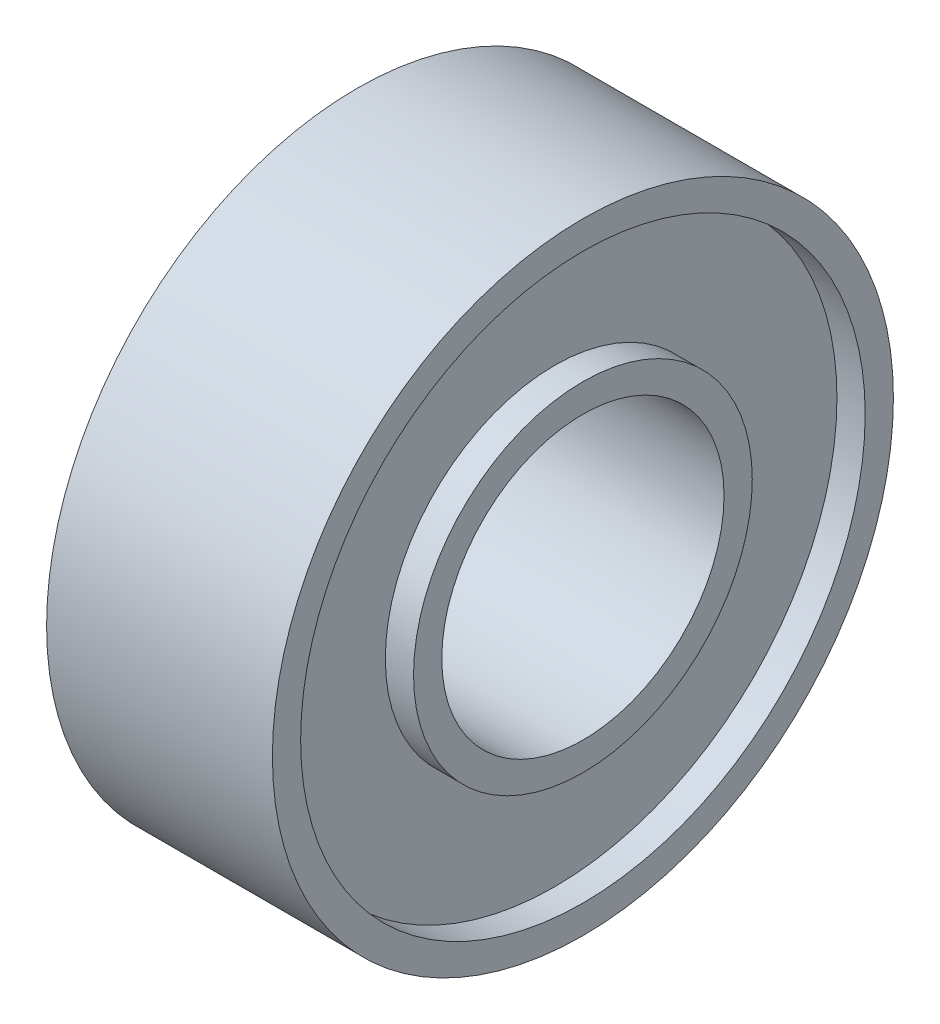
ISO-10303-21;
HEADER;
FILE_DESCRIPTION(('STEP AP214'),'2;1');
FILE_NAME('part.step','',(''),(''),'','','');
FILE_SCHEMA(('AUTOMOTIVE_DESIGN { 1 0 10303 214 1 1 1 1 }'));
ENDSEC;
DATA;
#1=APPLICATION_CONTEXT('core data for automotive mechanical design processes');
#2=APPLICATION_PROTOCOL_DEFINITION('international standard','automotive_design',2000,#1);
#3=PRODUCT_CONTEXT('',#1,'mechanical');
#4=PRODUCT('Part','Part','',(#3));
#5=PRODUCT_RELATED_PRODUCT_CATEGORY('part','',(#4));
#6=PRODUCT_DEFINITION_FORMATION('','',#4);
#7=PRODUCT_DEFINITION_CONTEXT('part definition',#1,'design');
#8=PRODUCT_DEFINITION('design','',#6,#7);
#9=PRODUCT_DEFINITION_SHAPE('','',#8);
#10=(LENGTH_UNIT() NAMED_UNIT(*) SI_UNIT(.MILLI.,.METRE.));
#11=(NAMED_UNIT(*) PLANE_ANGLE_UNIT() SI_UNIT($,.RADIAN.));
#12=(NAMED_UNIT(*) SI_UNIT($,.STERADIAN.) SOLID_ANGLE_UNIT());
#13=UNCERTAINTY_MEASURE_WITH_UNIT(LENGTH_MEASURE(1.E-05),#10,'distance_accuracy_value','');
#14=(GEOMETRIC_REPRESENTATION_CONTEXT(3) GLOBAL_UNCERTAINTY_ASSIGNED_CONTEXT((#13)) GLOBAL_UNIT_ASSIGNED_CONTEXT((#10,
#11,#12)) REPRESENTATION_CONTEXT('',''));
#15=CARTESIAN_POINT('',(0.,0.,0.));
#16=DIRECTION('',(0.,0.,1.));
#17=DIRECTION('',(1.,0.,0.));
#18=AXIS2_PLACEMENT_3D('',#15,#16,#17);
#19=CARTESIAN_POINT('',(0.,0.,0.));
#20=DIRECTION('',(1.,0.,0.));
#21=DIRECTION('',(0.,0.,-1.));
#22=AXIS2_PLACEMENT_3D('',#19,#20,#21);
#23=PLANE('',#22);
#24=CARTESIAN_POINT('',(0.,0.,0.));
#25=DIRECTION('',(1.,0.,0.));
#26=DIRECTION('',(0.,0.,-1.));
#27=AXIS2_PLACEMENT_3D('',#24,#25,#26);
#28=CIRCLE('',#27,2.5);
#29=CARTESIAN_POINT('',(0.,0.,-2.5));
#30=VERTEX_POINT('',#29);
#31=EDGE_CURVE('E44',#30,#30,#28,.T.);
#32=ORIENTED_EDGE('',*,*,#31,.T.);
#33=EDGE_LOOP('',(#32));
#34=FACE_BOUND('',#33,.T.);
#35=CARTESIAN_POINT('',(0.,0.,0.));
#36=DIRECTION('',(-1.,0.,0.));
#37=DIRECTION('',(0.,0.,1.));
#38=AXIS2_PLACEMENT_3D('',#35,#36,#37);
#39=CIRCLE('',#38,3.);
#40=CARTESIAN_POINT('',(0.,0.,3.));
#41=VERTEX_POINT('',#40);
#42=EDGE_CURVE('E68',#41,#41,#39,.T.);
#43=ORIENTED_EDGE('',*,*,#42,.T.);
#44=EDGE_LOOP('',(#43));
#45=FACE_BOUND('',#44,.T.);
#46=ADVANCED_FACE('F31',(#34,#45),#23,.F.);
#47=CARTESIAN_POINT('',(4.,0.,0.));
#48=DIRECTION('',(1.,0.,0.));
#49=DIRECTION('',(0.,0.,-1.));
#50=AXIS2_PLACEMENT_3D('',#47,#48,#49);
#51=PLANE('',#50);
#52=CARTESIAN_POINT('',(4.,0.,0.));
#53=DIRECTION('',(1.,0.,0.));
#54=DIRECTION('',(0.,0.,-1.));
#55=AXIS2_PLACEMENT_3D('',#52,#53,#54);
#56=CIRCLE('',#55,2.5);
#57=CARTESIAN_POINT('',(4.,0.,-2.5));
#58=VERTEX_POINT('',#57);
#59=EDGE_CURVE('E42',#58,#58,#56,.T.);
#60=ORIENTED_EDGE('',*,*,#59,.F.);
#61=EDGE_LOOP('',(#60));
#62=FACE_BOUND('',#61,.T.);
#63=CARTESIAN_POINT('',(4.,0.,0.));
#64=DIRECTION('',(1.,0.,0.));
#65=DIRECTION('',(0.,0.,-1.));
#66=AXIS2_PLACEMENT_3D('',#63,#64,#65);
#67=CIRCLE('',#66,3.);
#68=CARTESIAN_POINT('',(4.,0.,-3.));
#69=VERTEX_POINT('',#68);
#70=EDGE_CURVE('E56',#69,#69,#67,.T.);
#71=ORIENTED_EDGE('',*,*,#70,.T.);
#72=EDGE_LOOP('',(#71));
#73=FACE_BOUND('',#72,.T.);
#74=ADVANCED_FACE('F106',(#62,#73),#51,.T.);
#75=CARTESIAN_POINT('',(4.,0.,0.));
#76=DIRECTION('',(1.,0.,0.));
#77=DIRECTION('',(0.,0.,-1.));
#78=AXIS2_PLACEMENT_3D('',#75,#76,#77);
#79=CIRCLE('',#78,5.);
#80=CARTESIAN_POINT('',(4.,0.,-5.));
#81=VERTEX_POINT('',#80);
#82=EDGE_CURVE('E50',#81,#81,#79,.T.);
#83=ORIENTED_EDGE('',*,*,#82,.F.);
#84=EDGE_LOOP('',(#83));
#85=FACE_BOUND('',#84,.T.);
#86=CARTESIAN_POINT('',(4.,0.,0.));
#87=DIRECTION('',(1.,0.,0.));
#88=DIRECTION('',(0.,0.,-1.));
#89=AXIS2_PLACEMENT_3D('',#86,#87,#88);
#90=CIRCLE('',#89,5.5);
#91=CARTESIAN_POINT('',(4.,0.,-5.5));
#92=VERTEX_POINT('',#91);
#93=EDGE_CURVE('E10',#92,#92,#90,.T.);
#94=ORIENTED_EDGE('',*,*,#93,.T.);
#95=EDGE_LOOP('',(#94));
#96=FACE_BOUND('',#95,.T.);
#97=ADVANCED_FACE('F93',(#85,#96),#51,.T.);
#98=CARTESIAN_POINT('',(0.,0.,0.));
#99=DIRECTION('',(-1.,0.,0.));
#100=DIRECTION('',(0.,0.,1.));
#101=AXIS2_PLACEMENT_3D('',#98,#99,#100);
#102=CIRCLE('',#101,5.);
#103=CARTESIAN_POINT('',(0.,0.,5.));
#104=VERTEX_POINT('',#103);
#105=EDGE_CURVE('E62',#104,#104,#102,.T.);
#106=ORIENTED_EDGE('',*,*,#105,.F.);
#107=EDGE_LOOP('',(#106));
#108=FACE_BOUND('',#107,.T.);
#109=CARTESIAN_POINT('',(0.,0.,0.));
#110=DIRECTION('',(1.,0.,0.));
#111=DIRECTION('',(0.,0.,-1.));
#112=AXIS2_PLACEMENT_3D('',#109,#110,#111);
#113=CIRCLE('',#112,5.5);
#114=CARTESIAN_POINT('',(0.,0.,-5.5));
#115=VERTEX_POINT('',#114);
#116=EDGE_CURVE('E35',#115,#115,#113,.T.);
#117=ORIENTED_EDGE('',*,*,#116,.F.);
#118=EDGE_LOOP('',(#117));
#119=FACE_BOUND('',#118,.T.);
#120=ADVANCED_FACE('F90',(#108,#119),#23,.F.);
#121=CARTESIAN_POINT('',(4.,0.,0.));
#122=DIRECTION('',(-1.,0.,0.));
#123=DIRECTION('',(0.,0.,1.));
#124=AXIS2_PLACEMENT_3D('',#121,#122,#123);
#125=CYLINDRICAL_SURFACE('',#124,5.5);
#126=ORIENTED_EDGE('',*,*,#93,.F.);
#127=EDGE_LOOP('',(#126));
#128=FACE_BOUND('',#127,.T.);
#129=ORIENTED_EDGE('',*,*,#116,.T.);
#130=EDGE_LOOP('',(#129));
#131=FACE_BOUND('',#130,.T.);
#132=ADVANCED_FACE('F33',(#128,#131),#125,.T.);
#133=CARTESIAN_POINT('',(4.,0.,0.));
#134=DIRECTION('',(-1.,0.,0.));
#135=DIRECTION('',(0.,0.,1.));
#136=AXIS2_PLACEMENT_3D('',#133,#134,#135);
#137=CYLINDRICAL_SURFACE('',#136,2.5);
#138=ORIENTED_EDGE('',*,*,#59,.T.);
#139=EDGE_LOOP('',(#138));
#140=FACE_BOUND('',#139,.T.);
#141=ORIENTED_EDGE('',*,*,#31,.F.);
#142=EDGE_LOOP('',(#141));
#143=FACE_BOUND('',#142,.T.);
#144=ADVANCED_FACE('F97',(#140,#143),#137,.F.);
#145=CARTESIAN_POINT('',(3.5,0.,0.));
#146=DIRECTION('',(1.,0.,0.));
#147=DIRECTION('',(0.,0.,-1.));
#148=AXIS2_PLACEMENT_3D('',#145,#146,#147);
#149=CYLINDRICAL_SURFACE('',#148,5.);
#150=CARTESIAN_POINT('',(3.5,0.,0.));
#151=DIRECTION('',(1.,0.,0.));
#152=DIRECTION('',(0.,0.,-1.));
#153=AXIS2_PLACEMENT_3D('',#150,#151,#152);
#154=CIRCLE('',#153,5.);
#155=CARTESIAN_POINT('',(3.5,0.,-5.));
#156=VERTEX_POINT('',#155);
#157=EDGE_CURVE('E47',#156,#156,#154,.T.);
#158=ORIENTED_EDGE('',*,*,#157,.F.);
#159=EDGE_LOOP('',(#158));
#160=FACE_BOUND('',#159,.T.);
#161=ORIENTED_EDGE('',*,*,#82,.T.);
#162=EDGE_LOOP('',(#161));
#163=FACE_BOUND('',#162,.T.);
#164=ADVANCED_FACE('F102',(#160,#163),#149,.F.);
#165=CARTESIAN_POINT('',(3.5,0.,0.));
#166=DIRECTION('',(1.,0.,0.));
#167=DIRECTION('',(0.,0.,-1.));
#168=AXIS2_PLACEMENT_3D('',#165,#166,#167);
#169=PLANE('',#168);
#170=CARTESIAN_POINT('',(3.5,0.,0.));
#171=DIRECTION('',(1.,0.,0.));
#172=DIRECTION('',(0.,0.,-1.));
#173=AXIS2_PLACEMENT_3D('',#170,#171,#172);
#174=CIRCLE('',#173,3.);
#175=CARTESIAN_POINT('',(3.5,0.,-3.));
#176=VERTEX_POINT('',#175);
#177=EDGE_CURVE('E53',#176,#176,#174,.T.);
#178=ORIENTED_EDGE('',*,*,#177,.F.);
#179=EDGE_LOOP('',(#178));
#180=FACE_BOUND('',#179,.T.);
#181=ORIENTED_EDGE('',*,*,#157,.T.);
#182=EDGE_LOOP('',(#181));
#183=FACE_BOUND('',#182,.T.);
#184=ADVANCED_FACE('F119',(#180,#183),#169,.T.);
#185=CARTESIAN_POINT('',(3.5,0.,0.));
#186=DIRECTION('',(1.,0.,0.));
#187=DIRECTION('',(0.,0.,-1.));
#188=AXIS2_PLACEMENT_3D('',#185,#186,#187);
#189=CYLINDRICAL_SURFACE('',#188,3.);
#190=ORIENTED_EDGE('',*,*,#177,.T.);
#191=EDGE_LOOP('',(#190));
#192=FACE_BOUND('',#191,.T.);
#193=ORIENTED_EDGE('',*,*,#70,.F.);
#194=EDGE_LOOP('',(#193));
#195=FACE_BOUND('',#194,.T.);
#196=ADVANCED_FACE('F86',(#192,#195),#189,.T.);
#197=CARTESIAN_POINT('',(0.5,0.,0.));
#198=DIRECTION('',(-1.,0.,0.));
#199=DIRECTION('',(0.,0.,1.));
#200=AXIS2_PLACEMENT_3D('',#197,#198,#199);
#201=CYLINDRICAL_SURFACE('',#200,5.);
#202=CARTESIAN_POINT('',(0.5,0.,0.));
#203=DIRECTION('',(-1.,0.,0.));
#204=DIRECTION('',(0.,0.,1.));
#205=AXIS2_PLACEMENT_3D('',#202,#203,#204);
#206=CIRCLE('',#205,5.);
#207=CARTESIAN_POINT('',(0.5,0.,5.));
#208=VERTEX_POINT('',#207);
#209=EDGE_CURVE('E59',#208,#208,#206,.T.);
#210=ORIENTED_EDGE('',*,*,#209,.F.);
#211=EDGE_LOOP('',(#210));
#212=FACE_BOUND('',#211,.T.);
#213=ORIENTED_EDGE('',*,*,#105,.T.);
#214=EDGE_LOOP('',(#213));
#215=FACE_BOUND('',#214,.T.);
#216=ADVANCED_FACE('F80',(#212,#215),#201,.F.);
#217=CARTESIAN_POINT('',(0.5,0.,0.));
#218=DIRECTION('',(-1.,0.,0.));
#219=DIRECTION('',(0.,0.,1.));
#220=AXIS2_PLACEMENT_3D('',#217,#218,#219);
#221=PLANE('',#220);
#222=CARTESIAN_POINT('',(0.5,0.,0.));
#223=DIRECTION('',(-1.,0.,0.));
#224=DIRECTION('',(0.,0.,1.));
#225=AXIS2_PLACEMENT_3D('',#222,#223,#224);
#226=CIRCLE('',#225,3.);
#227=CARTESIAN_POINT('',(0.5,0.,3.));
#228=VERTEX_POINT('',#227);
#229=EDGE_CURVE('E65',#228,#228,#226,.T.);
#230=ORIENTED_EDGE('',*,*,#229,.F.);
#231=EDGE_LOOP('',(#230));
#232=FACE_BOUND('',#231,.T.);
#233=ORIENTED_EDGE('',*,*,#209,.T.);
#234=EDGE_LOOP('',(#233));
#235=FACE_BOUND('',#234,.T.);
#236=ADVANCED_FACE('F77',(#232,#235),#221,.T.);
#237=CARTESIAN_POINT('',(0.5,0.,0.));
#238=DIRECTION('',(-1.,0.,0.));
#239=DIRECTION('',(0.,0.,1.));
#240=AXIS2_PLACEMENT_3D('',#237,#238,#239);
#241=CYLINDRICAL_SURFACE('',#240,3.);
#242=ORIENTED_EDGE('',*,*,#229,.T.);
#243=EDGE_LOOP('',(#242));
#244=FACE_BOUND('',#243,.T.);
#245=ORIENTED_EDGE('',*,*,#42,.F.);
#246=EDGE_LOOP('',(#245));
#247=FACE_BOUND('',#246,.T.);
#248=ADVANCED_FACE('F74',(#244,#247),#241,.T.);
#249=CLOSED_SHELL('',(#46,#74,#97,#120,#132,#144,#164,#184,#196,#216,#236,#248));
#250=MANIFOLD_SOLID_BREP('B2',#249);
#251=ADVANCED_BREP_SHAPE_REPRESENTATION('',(#18,#250),#14);
#252=SHAPE_DEFINITION_REPRESENTATION(#9,#251);
ENDSEC;
END-ISO-10303-21;
